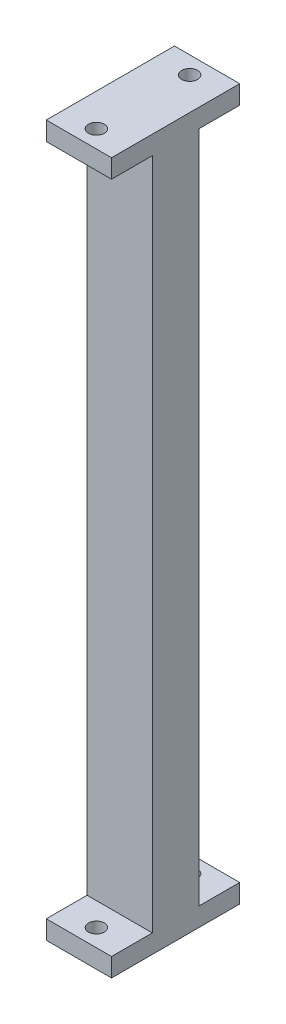
ISO-10303-21;
HEADER;
FILE_DESCRIPTION(('STEP AP214'),'2;1');
FILE_NAME('part.step','',(''),(''),'','','');
FILE_SCHEMA(('AUTOMOTIVE_DESIGN { 1 0 10303 214 1 1 1 1 }'));
ENDSEC;
DATA;
#1=APPLICATION_CONTEXT('core data for automotive mechanical design processes');
#2=APPLICATION_PROTOCOL_DEFINITION('international standard','automotive_design',2000,#1);
#3=PRODUCT_CONTEXT('',#1,'mechanical');
#4=PRODUCT('Part','Part','',(#3));
#5=PRODUCT_RELATED_PRODUCT_CATEGORY('part','',(#4));
#6=PRODUCT_DEFINITION_FORMATION('','',#4);
#7=PRODUCT_DEFINITION_CONTEXT('part definition',#1,'design');
#8=PRODUCT_DEFINITION('design','',#6,#7);
#9=PRODUCT_DEFINITION_SHAPE('','',#8);
#10=(LENGTH_UNIT() NAMED_UNIT(*) SI_UNIT(.MILLI.,.METRE.));
#11=(NAMED_UNIT(*) PLANE_ANGLE_UNIT() SI_UNIT($,.RADIAN.));
#12=(NAMED_UNIT(*) SI_UNIT($,.STERADIAN.) SOLID_ANGLE_UNIT());
#13=UNCERTAINTY_MEASURE_WITH_UNIT(LENGTH_MEASURE(1.E-05),#10,'distance_accuracy_value','');
#14=(GEOMETRIC_REPRESENTATION_CONTEXT(3) GLOBAL_UNCERTAINTY_ASSIGNED_CONTEXT((#13)) GLOBAL_UNIT_ASSIGNED_CONTEXT((#10,
#11,#12)) REPRESENTATION_CONTEXT('',''));
#15=CARTESIAN_POINT('',(0.,0.,0.));
#16=DIRECTION('',(0.,0.,1.));
#17=DIRECTION('',(1.,0.,0.));
#18=AXIS2_PLACEMENT_3D('',#15,#16,#17);
#19=CARTESIAN_POINT('',(7.,76.2,-5.));
#20=DIRECTION('',(-1.,0.,0.));
#21=DIRECTION('',(0.,0.,1.));
#22=AXIS2_PLACEMENT_3D('',#19,#20,#21);
#23=PLANE('',#22);
#24=DIRECTION('',(0.,-1.,0.));
#25=VECTOR('',#24,1.);
#26=CARTESIAN_POINT('',(7.,76.2,5.));
#27=LINE('',#26,#25);
#28=CARTESIAN_POINT('',(7.,72.2,5.));
#29=VERTEX_POINT('',#28);
#30=CARTESIAN_POINT('',(7.,-72.1999999999999,5.));
#31=VERTEX_POINT('',#30);
#32=EDGE_CURVE('E140',#29,#31,#27,.T.);
#33=ORIENTED_EDGE('',*,*,#32,.T.);
#34=DIRECTION('',(0.,0.,-1.));
#35=VECTOR('',#34,1.);
#36=CARTESIAN_POINT('',(6.99999999999999,-72.2,-13.75));
#37=LINE('',#36,#35);
#38=CARTESIAN_POINT('',(7.,-72.2,13.75));
#39=VERTEX_POINT('',#38);
#40=EDGE_CURVE('E122',#39,#31,#37,.T.);
#41=ORIENTED_EDGE('',*,*,#40,.F.);
#42=DIRECTION('',(0.,-1.,0.));
#43=VECTOR('',#42,1.);
#44=CARTESIAN_POINT('',(7.,-72.2,13.75));
#45=LINE('',#44,#43);
#46=CARTESIAN_POINT('',(7.,-76.2,13.75));
#47=VERTEX_POINT('',#46);
#48=EDGE_CURVE('E131',#39,#47,#45,.T.);
#49=ORIENTED_EDGE('',*,*,#48,.T.);
#50=DIRECTION('',(0.,0.,-1.));
#51=VECTOR('',#50,1.);
#52=CARTESIAN_POINT('',(7.,-76.2,-5.));
#53=LINE('',#52,#51);
#54=CARTESIAN_POINT('',(6.99999999999999,-76.2,-13.75));
#55=VERTEX_POINT('',#54);
#56=EDGE_CURVE('E211',#47,#55,#53,.T.);
#57=ORIENTED_EDGE('',*,*,#56,.T.);
#58=DIRECTION('',(0.,-1.,0.));
#59=VECTOR('',#58,1.);
#60=CARTESIAN_POINT('',(6.99999999999999,-72.2,-13.75));
#61=LINE('',#60,#59);
#62=CARTESIAN_POINT('',(6.99999999999999,-72.2,-13.75));
#63=VERTEX_POINT('',#62);
#64=EDGE_CURVE('E155',#63,#55,#61,.T.);
#65=ORIENTED_EDGE('',*,*,#64,.F.);
#66=CARTESIAN_POINT('',(6.99999999999999,-72.2,-5.));
#67=VERTEX_POINT('',#66);
#68=EDGE_CURVE('E141',#67,#63,#37,.T.);
#69=ORIENTED_EDGE('',*,*,#68,.F.);
#70=DIRECTION('',(0.,-1.,0.));
#71=VECTOR('',#70,1.);
#72=CARTESIAN_POINT('',(7.,76.2,-5.));
#73=LINE('',#72,#71);
#74=CARTESIAN_POINT('',(6.99999999999999,72.2,-5.));
#75=VERTEX_POINT('',#74);
#76=EDGE_CURVE('E224',#75,#67,#73,.T.);
#77=ORIENTED_EDGE('',*,*,#76,.F.);
#78=DIRECTION('',(0.,0.,-1.));
#79=VECTOR('',#78,1.);
#80=CARTESIAN_POINT('',(6.99999999999999,72.2,-13.75));
#81=LINE('',#80,#79);
#82=CARTESIAN_POINT('',(6.99999999999999,72.2,-13.75));
#83=VERTEX_POINT('',#82);
#84=EDGE_CURVE('E181',#75,#83,#81,.T.);
#85=ORIENTED_EDGE('',*,*,#84,.T.);
#86=DIRECTION('',(0.,1.,0.));
#87=VECTOR('',#86,1.);
#88=CARTESIAN_POINT('',(6.99999999999999,72.2,-13.75));
#89=LINE('',#88,#87);
#90=CARTESIAN_POINT('',(6.99999999999999,76.2,-13.75));
#91=VERTEX_POINT('',#90);
#92=EDGE_CURVE('E191',#83,#91,#89,.T.);
#93=ORIENTED_EDGE('',*,*,#92,.T.);
#94=DIRECTION('',(0.,0.,-1.));
#95=VECTOR('',#94,1.);
#96=CARTESIAN_POINT('',(7.,76.2,-5.));
#97=LINE('',#96,#95);
#98=CARTESIAN_POINT('',(7.,76.2,13.75));
#99=VERTEX_POINT('',#98);
#100=EDGE_CURVE('E212',#99,#91,#97,.T.);
#101=ORIENTED_EDGE('',*,*,#100,.F.);
#102=DIRECTION('',(0.,1.,0.));
#103=VECTOR('',#102,1.);
#104=CARTESIAN_POINT('',(7.,72.2,13.75));
#105=LINE('',#104,#103);
#106=CARTESIAN_POINT('',(7.,72.2,13.75));
#107=VERTEX_POINT('',#106);
#108=EDGE_CURVE('E197',#107,#99,#105,.T.);
#109=ORIENTED_EDGE('',*,*,#108,.F.);
#110=EDGE_CURVE('E178',#107,#29,#81,.T.);
#111=ORIENTED_EDGE('',*,*,#110,.T.);
#112=EDGE_LOOP('',(#33,#41,#49,#57,#65,#69,#77,#85,#93,#101,#109,#111));
#113=FACE_BOUND('',#112,.T.);
#114=ADVANCED_FACE('F32',(#113),#23,.F.);
#115=CARTESIAN_POINT('',(-7.,76.2,-5.));
#116=DIRECTION('',(0.,0.,1.));
#117=DIRECTION('',(1.,0.,0.));
#118=AXIS2_PLACEMENT_3D('',#115,#116,#117);
#119=PLANE('',#118);
#120=ORIENTED_EDGE('',*,*,#76,.T.);
#121=DIRECTION('',(-1.,0.,0.));
#122=VECTOR('',#121,1.);
#123=CARTESIAN_POINT('',(-7.,-72.2,-5.));
#124=LINE('',#123,#122);
#125=CARTESIAN_POINT('',(-7.,-72.2,-5.));
#126=VERTEX_POINT('',#125);
#127=EDGE_CURVE('E158',#67,#126,#124,.T.);
#128=ORIENTED_EDGE('',*,*,#127,.T.);
#129=DIRECTION('',(0.,-1.,0.));
#130=VECTOR('',#129,1.);
#131=CARTESIAN_POINT('',(-7.,76.2,-5.));
#132=LINE('',#131,#130);
#133=CARTESIAN_POINT('',(-7.,72.2,-5.));
#134=VERTEX_POINT('',#133);
#135=EDGE_CURVE('E221',#134,#126,#132,.T.);
#136=ORIENTED_EDGE('',*,*,#135,.F.);
#137=DIRECTION('',(1.,0.,0.));
#138=VECTOR('',#137,1.);
#139=CARTESIAN_POINT('',(-7.,72.2,-5.));
#140=LINE('',#139,#138);
#141=EDGE_CURVE('E200',#134,#75,#140,.T.);
#142=ORIENTED_EDGE('',*,*,#141,.T.);
#143=EDGE_LOOP('',(#120,#128,#136,#142));
#144=FACE_BOUND('',#143,.T.);
#145=ADVANCED_FACE('F248',(#144),#119,.F.);
#146=CARTESIAN_POINT('',(-7.,76.2,-5.));
#147=DIRECTION('',(1.,0.,0.));
#148=DIRECTION('',(0.,0.,-1.));
#149=AXIS2_PLACEMENT_3D('',#146,#147,#148);
#150=PLANE('',#149);
#151=ORIENTED_EDGE('',*,*,#135,.T.);
#152=DIRECTION('',(0.,0.,1.));
#153=VECTOR('',#152,1.);
#154=CARTESIAN_POINT('',(-7.,-72.2,-13.75));
#155=LINE('',#154,#153);
#156=CARTESIAN_POINT('',(-7.,-72.2,-13.75));
#157=VERTEX_POINT('',#156);
#158=EDGE_CURVE('E148',#157,#126,#155,.T.);
#159=ORIENTED_EDGE('',*,*,#158,.F.);
#160=DIRECTION('',(0.,-1.,0.));
#161=VECTOR('',#160,1.);
#162=CARTESIAN_POINT('',(-7.,-72.2,-13.75));
#163=LINE('',#162,#161);
#164=CARTESIAN_POINT('',(-7.,-76.2,-13.75));
#165=VERTEX_POINT('',#164);
#166=EDGE_CURVE('E159',#157,#165,#163,.T.);
#167=ORIENTED_EDGE('',*,*,#166,.T.);
#168=DIRECTION('',(0.,0.,1.));
#169=VECTOR('',#168,1.);
#170=CARTESIAN_POINT('',(-7.,-76.2,-5.));
#171=LINE('',#170,#169);
#172=CARTESIAN_POINT('',(-7.,-76.2,13.75));
#173=VERTEX_POINT('',#172);
#174=EDGE_CURVE('E215',#165,#173,#171,.T.);
#175=ORIENTED_EDGE('',*,*,#174,.T.);
#176=DIRECTION('',(0.,-1.,0.));
#177=VECTOR('',#176,1.);
#178=CARTESIAN_POINT('',(-7.,-72.2,13.75));
#179=LINE('',#178,#177);
#180=CARTESIAN_POINT('',(-7.,-72.2,13.75));
#181=VERTEX_POINT('',#180);
#182=EDGE_CURVE('E136',#181,#173,#179,.T.);
#183=ORIENTED_EDGE('',*,*,#182,.F.);
#184=CARTESIAN_POINT('',(-7.,-72.1999999999999,5.));
#185=VERTEX_POINT('',#184);
#186=EDGE_CURVE('E124',#185,#181,#155,.T.);
#187=ORIENTED_EDGE('',*,*,#186,.F.);
#188=DIRECTION('',(0.,-1.,0.));
#189=VECTOR('',#188,1.);
#190=CARTESIAN_POINT('',(-7.,76.2,5.));
#191=LINE('',#190,#189);
#192=CARTESIAN_POINT('',(-7.,72.2,5.));
#193=VERTEX_POINT('',#192);
#194=EDGE_CURVE('E45',#193,#185,#191,.T.);
#195=ORIENTED_EDGE('',*,*,#194,.F.);
#196=DIRECTION('',(0.,0.,1.));
#197=VECTOR('',#196,1.);
#198=CARTESIAN_POINT('',(-7.,72.2,-13.75));
#199=LINE('',#198,#197);
#200=CARTESIAN_POINT('',(-7.,72.2,13.75));
#201=VERTEX_POINT('',#200);
#202=EDGE_CURVE('E184',#193,#201,#199,.T.);
#203=ORIENTED_EDGE('',*,*,#202,.T.);
#204=DIRECTION('',(0.,1.,0.));
#205=VECTOR('',#204,1.);
#206=CARTESIAN_POINT('',(-7.,72.2,13.75));
#207=LINE('',#206,#205);
#208=CARTESIAN_POINT('',(-7.,76.2,13.75));
#209=VERTEX_POINT('',#208);
#210=EDGE_CURVE('E201',#201,#209,#207,.T.);
#211=ORIENTED_EDGE('',*,*,#210,.T.);
#212=DIRECTION('',(0.,0.,1.));
#213=VECTOR('',#212,1.);
#214=CARTESIAN_POINT('',(-7.,76.2,-5.));
#215=LINE('',#214,#213);
#216=CARTESIAN_POINT('',(-7.,76.2,-13.75));
#217=VERTEX_POINT('',#216);
#218=EDGE_CURVE('E214',#217,#209,#215,.T.);
#219=ORIENTED_EDGE('',*,*,#218,.F.);
#220=DIRECTION('',(0.,1.,0.));
#221=VECTOR('',#220,1.);
#222=CARTESIAN_POINT('',(-7.,72.2,-13.75));
#223=LINE('',#222,#221);
#224=CARTESIAN_POINT('',(-7.,72.2,-13.75));
#225=VERTEX_POINT('',#224);
#226=EDGE_CURVE('E204',#225,#217,#223,.T.);
#227=ORIENTED_EDGE('',*,*,#226,.F.);
#228=EDGE_CURVE('E185',#225,#134,#199,.T.);
#229=ORIENTED_EDGE('',*,*,#228,.T.);
#230=EDGE_LOOP('',(#151,#159,#167,#175,#183,#187,#195,#203,#211,#219,#227,#229));
#231=FACE_BOUND('',#230,.T.);
#232=ADVANCED_FACE('F230',(#231),#150,.F.);
#233=CARTESIAN_POINT('',(-7.,76.2,5.));
#234=DIRECTION('',(0.,0.,-1.));
#235=DIRECTION('',(-1.,0.,0.));
#236=AXIS2_PLACEMENT_3D('',#233,#234,#235);
#237=PLANE('',#236);
#238=ORIENTED_EDGE('',*,*,#194,.T.);
#239=DIRECTION('',(1.,0.,0.));
#240=VECTOR('',#239,1.);
#241=CARTESIAN_POINT('',(-7.,-72.2,5.));
#242=LINE('',#241,#240);
#243=EDGE_CURVE('E11',#185,#31,#242,.T.);
#244=ORIENTED_EDGE('',*,*,#243,.T.);
#245=ORIENTED_EDGE('',*,*,#32,.F.);
#246=DIRECTION('',(-1.,0.,0.));
#247=VECTOR('',#246,1.);
#248=CARTESIAN_POINT('',(-7.,72.2,5.));
#249=LINE('',#248,#247);
#250=EDGE_CURVE('E39',#29,#193,#249,.T.);
#251=ORIENTED_EDGE('',*,*,#250,.T.);
#252=EDGE_LOOP('',(#238,#244,#245,#251));
#253=FACE_BOUND('',#252,.T.);
#254=ADVANCED_FACE('F226',(#253),#237,.F.);
#255=CARTESIAN_POINT('',(0.,76.2,0.));
#256=DIRECTION('',(0.,1.,0.));
#257=DIRECTION('',(0.,0.,1.));
#258=AXIS2_PLACEMENT_3D('',#255,#256,#257);
#259=PLANE('',#258);
#260=ORIENTED_EDGE('',*,*,#100,.T.);
#261=DIRECTION('',(-1.,0.,0.));
#262=VECTOR('',#261,1.);
#263=CARTESIAN_POINT('',(6.99999999999999,76.2,-13.75));
#264=LINE('',#263,#262);
#265=EDGE_CURVE('E175',#91,#217,#264,.T.);
#266=ORIENTED_EDGE('',*,*,#265,.T.);
#267=ORIENTED_EDGE('',*,*,#218,.T.);
#268=DIRECTION('',(1.,0.,0.));
#269=VECTOR('',#268,1.);
#270=CARTESIAN_POINT('',(7.,76.2,13.75));
#271=LINE('',#270,#269);
#272=EDGE_CURVE('E194',#209,#99,#271,.T.);
#273=ORIENTED_EDGE('',*,*,#272,.T.);
#274=EDGE_LOOP('',(#260,#266,#267,#273));
#275=FACE_BOUND('',#274,.T.);
#276=CARTESIAN_POINT('',(0.,76.2,10.));
#277=DIRECTION('',(0.,1.,0.));
#278=DIRECTION('',(0.,0.,1.));
#279=AXIS2_PLACEMENT_3D('',#276,#277,#278);
#280=CIRCLE('',#279,1.7);
#281=CARTESIAN_POINT('',(0.,76.2,11.7));
#282=VERTEX_POINT('',#281);
#283=EDGE_CURVE('E165',#282,#282,#280,.T.);
#284=ORIENTED_EDGE('',*,*,#283,.F.);
#285=EDGE_LOOP('',(#284));
#286=FACE_BOUND('',#285,.T.);
#287=CARTESIAN_POINT('',(0.,76.2,-10.));
#288=DIRECTION('',(0.,1.,0.));
#289=DIRECTION('',(0.,0.,1.));
#290=AXIS2_PLACEMENT_3D('',#287,#288,#289);
#291=CIRCLE('',#290,1.7);
#292=CARTESIAN_POINT('',(0.,76.2,-8.3));
#293=VERTEX_POINT('',#292);
#294=EDGE_CURVE('E169',#293,#293,#291,.T.);
#295=ORIENTED_EDGE('',*,*,#294,.F.);
#296=EDGE_LOOP('',(#295));
#297=FACE_BOUND('',#296,.T.);
#298=ADVANCED_FACE('F262',(#275,#286,#297),#259,.T.);
#299=CARTESIAN_POINT('',(0.,-76.2,0.));
#300=DIRECTION('',(0.,1.,0.));
#301=DIRECTION('',(0.,0.,1.));
#302=AXIS2_PLACEMENT_3D('',#299,#300,#301);
#303=PLANE('',#302);
#304=ORIENTED_EDGE('',*,*,#56,.F.);
#305=DIRECTION('',(1.,0.,0.));
#306=VECTOR('',#305,1.);
#307=CARTESIAN_POINT('',(7.,-76.2,13.75));
#308=LINE('',#307,#306);
#309=EDGE_CURVE('E134',#173,#47,#308,.T.);
#310=ORIENTED_EDGE('',*,*,#309,.F.);
#311=ORIENTED_EDGE('',*,*,#174,.F.);
#312=DIRECTION('',(-1.,0.,0.));
#313=VECTOR('',#312,1.);
#314=CARTESIAN_POINT('',(6.99999999999999,-76.2,-13.75));
#315=LINE('',#314,#313);
#316=EDGE_CURVE('E143',#55,#165,#315,.T.);
#317=ORIENTED_EDGE('',*,*,#316,.F.);
#318=EDGE_LOOP('',(#304,#310,#311,#317));
#319=FACE_BOUND('',#318,.T.);
#320=CARTESIAN_POINT('',(0.,-76.2,10.));
#321=DIRECTION('',(0.,1.,0.));
#322=DIRECTION('',(0.,0.,1.));
#323=AXIS2_PLACEMENT_3D('',#320,#321,#322);
#324=CIRCLE('',#323,1.7);
#325=CARTESIAN_POINT('',(0.,-76.2,11.7));
#326=VERTEX_POINT('',#325);
#327=EDGE_CURVE('E424',#326,#326,#324,.T.);
#328=ORIENTED_EDGE('',*,*,#327,.T.);
#329=EDGE_LOOP('',(#328));
#330=FACE_BOUND('',#329,.T.);
#331=CARTESIAN_POINT('',(0.,-76.2,-10.));
#332=DIRECTION('',(0.,1.,0.));
#333=DIRECTION('',(0.,0.,1.));
#334=AXIS2_PLACEMENT_3D('',#331,#332,#333);
#335=CIRCLE('',#334,1.7);
#336=CARTESIAN_POINT('',(0.,-76.2,-8.3));
#337=VERTEX_POINT('',#336);
#338=EDGE_CURVE('E145',#337,#337,#335,.T.);
#339=ORIENTED_EDGE('',*,*,#338,.T.);
#340=EDGE_LOOP('',(#339));
#341=FACE_BOUND('',#340,.T.);
#342=ADVANCED_FACE('F233',(#319,#330,#341),#303,.F.);
#343=CARTESIAN_POINT('',(7.,72.2,13.75));
#344=DIRECTION('',(0.,0.,1.));
#345=DIRECTION('',(1.,0.,0.));
#346=AXIS2_PLACEMENT_3D('',#343,#344,#345);
#347=PLANE('',#346);
#348=ORIENTED_EDGE('',*,*,#272,.F.);
#349=ORIENTED_EDGE('',*,*,#210,.F.);
#350=DIRECTION('',(1.,0.,0.));
#351=VECTOR('',#350,1.);
#352=CARTESIAN_POINT('',(7.,72.2,13.75));
#353=LINE('',#352,#351);
#354=EDGE_CURVE('E188',#201,#107,#353,.T.);
#355=ORIENTED_EDGE('',*,*,#354,.T.);
#356=ORIENTED_EDGE('',*,*,#108,.T.);
#357=EDGE_LOOP('',(#348,#349,#355,#356));
#358=FACE_BOUND('',#357,.T.);
#359=ADVANCED_FACE('F260',(#358),#347,.T.);
#360=CARTESIAN_POINT('',(0.,72.2,10.));
#361=DIRECTION('',(0.,1.,0.));
#362=DIRECTION('',(0.,0.,1.));
#363=AXIS2_PLACEMENT_3D('',#360,#361,#362);
#364=CYLINDRICAL_SURFACE('',#363,1.7);
#365=CARTESIAN_POINT('',(0.,72.2,10.));
#366=DIRECTION('',(0.,1.,0.));
#367=DIRECTION('',(0.,0.,1.));
#368=AXIS2_PLACEMENT_3D('',#365,#366,#367);
#369=CIRCLE('',#368,1.7);
#370=CARTESIAN_POINT('',(0.,72.2,11.7));
#371=VERTEX_POINT('',#370);
#372=EDGE_CURVE('E166',#371,#371,#369,.T.);
#373=ORIENTED_EDGE('',*,*,#372,.F.);
#374=EDGE_LOOP('',(#373));
#375=FACE_BOUND('',#374,.T.);
#376=ORIENTED_EDGE('',*,*,#283,.T.);
#377=EDGE_LOOP('',(#376));
#378=FACE_BOUND('',#377,.T.);
#379=ADVANCED_FACE('F266',(#375,#378),#364,.F.);
#380=CARTESIAN_POINT('',(0.,72.2,0.));
#381=DIRECTION('',(0.,-1.,0.));
#382=DIRECTION('',(0.,0.,-1.));
#383=AXIS2_PLACEMENT_3D('',#380,#381,#382);
#384=PLANE('',#383);
#385=ORIENTED_EDGE('',*,*,#372,.T.);
#386=EDGE_LOOP('',(#385));
#387=FACE_BOUND('',#386,.T.);
#388=ORIENTED_EDGE('',*,*,#250,.F.);
#389=ORIENTED_EDGE('',*,*,#110,.F.);
#390=ORIENTED_EDGE('',*,*,#354,.F.);
#391=ORIENTED_EDGE('',*,*,#202,.F.);
#392=EDGE_LOOP('',(#388,#389,#390,#391));
#393=FACE_BOUND('',#392,.T.);
#394=ADVANCED_FACE('F264',(#387,#393),#384,.T.);
#395=CARTESIAN_POINT('',(0.,72.2,-10.));
#396=DIRECTION('',(0.,1.,0.));
#397=DIRECTION('',(0.,0.,1.));
#398=AXIS2_PLACEMENT_3D('',#395,#396,#397);
#399=CIRCLE('',#398,1.7);
#400=CARTESIAN_POINT('',(0.,72.2,-8.3));
#401=VERTEX_POINT('',#400);
#402=EDGE_CURVE('E172',#401,#401,#399,.T.);
#403=ORIENTED_EDGE('',*,*,#402,.T.);
#404=EDGE_LOOP('',(#403));
#405=FACE_BOUND('',#404,.T.);
#406=ORIENTED_EDGE('',*,*,#141,.F.);
#407=ORIENTED_EDGE('',*,*,#228,.F.);
#408=DIRECTION('',(-1.,0.,0.));
#409=VECTOR('',#408,1.);
#410=CARTESIAN_POINT('',(6.99999999999999,72.2,-13.75));
#411=LINE('',#410,#409);
#412=EDGE_CURVE('E180',#83,#225,#411,.T.);
#413=ORIENTED_EDGE('',*,*,#412,.F.);
#414=ORIENTED_EDGE('',*,*,#84,.F.);
#415=EDGE_LOOP('',(#406,#407,#413,#414));
#416=FACE_BOUND('',#415,.T.);
#417=ADVANCED_FACE('F252',(#405,#416),#384,.T.);
#418=CARTESIAN_POINT('',(6.99999999999999,72.2,-13.75));
#419=DIRECTION('',(0.,0.,-1.));
#420=DIRECTION('',(-1.,0.,0.));
#421=AXIS2_PLACEMENT_3D('',#418,#419,#420);
#422=PLANE('',#421);
#423=ORIENTED_EDGE('',*,*,#265,.F.);
#424=ORIENTED_EDGE('',*,*,#92,.F.);
#425=ORIENTED_EDGE('',*,*,#412,.T.);
#426=ORIENTED_EDGE('',*,*,#226,.T.);
#427=EDGE_LOOP('',(#423,#424,#425,#426));
#428=FACE_BOUND('',#427,.T.);
#429=ADVANCED_FACE('F256',(#428),#422,.T.);
#430=CARTESIAN_POINT('',(0.,72.2,-10.));
#431=DIRECTION('',(0.,1.,0.));
#432=DIRECTION('',(0.,0.,1.));
#433=AXIS2_PLACEMENT_3D('',#430,#431,#432);
#434=CYLINDRICAL_SURFACE('',#433,1.7);
#435=ORIENTED_EDGE('',*,*,#402,.F.);
#436=EDGE_LOOP('',(#435));
#437=FACE_BOUND('',#436,.T.);
#438=ORIENTED_EDGE('',*,*,#294,.T.);
#439=EDGE_LOOP('',(#438));
#440=FACE_BOUND('',#439,.T.);
#441=ADVANCED_FACE('F294',(#437,#440),#434,.F.);
#442=CARTESIAN_POINT('',(0.,-72.2,10.));
#443=DIRECTION('',(0.,-1.,0.));
#444=DIRECTION('',(0.,0.,-1.));
#445=AXIS2_PLACEMENT_3D('',#442,#443,#444);
#446=CYLINDRICAL_SURFACE('',#445,1.7);
#447=CARTESIAN_POINT('',(0.,-72.2,10.));
#448=DIRECTION('',(0.,1.,0.));
#449=DIRECTION('',(0.,0.,1.));
#450=AXIS2_PLACEMENT_3D('',#447,#448,#449);
#451=CIRCLE('',#450,1.7);
#452=CARTESIAN_POINT('',(0.,-72.2,11.7));
#453=VERTEX_POINT('',#452);
#454=EDGE_CURVE('E422',#453,#453,#451,.T.);
#455=ORIENTED_EDGE('',*,*,#454,.T.);
#456=EDGE_LOOP('',(#455));
#457=FACE_BOUND('',#456,.T.);
#458=ORIENTED_EDGE('',*,*,#327,.F.);
#459=EDGE_LOOP('',(#458));
#460=FACE_BOUND('',#459,.T.);
#461=ADVANCED_FACE('F329',(#457,#460),#446,.F.);
#462=CARTESIAN_POINT('',(7.,-72.2,13.75));
#463=DIRECTION('',(0.,0.,-1.));
#464=DIRECTION('',(-1.,0.,0.));
#465=AXIS2_PLACEMENT_3D('',#462,#463,#464);
#466=PLANE('',#465);
#467=ORIENTED_EDGE('',*,*,#309,.T.);
#468=ORIENTED_EDGE('',*,*,#48,.F.);
#469=DIRECTION('',(1.,0.,0.));
#470=VECTOR('',#469,1.);
#471=CARTESIAN_POINT('',(7.,-72.2,13.75));
#472=LINE('',#471,#470);
#473=EDGE_CURVE('E118',#181,#39,#472,.T.);
#474=ORIENTED_EDGE('',*,*,#473,.F.);
#475=ORIENTED_EDGE('',*,*,#182,.T.);
#476=EDGE_LOOP('',(#467,#468,#474,#475));
#477=FACE_BOUND('',#476,.T.);
#478=ADVANCED_FACE('F132',(#477),#466,.F.);
#479=CARTESIAN_POINT('',(0.,-72.2,0.));
#480=DIRECTION('',(0.,1.,0.));
#481=DIRECTION('',(0.,0.,-1.));
#482=AXIS2_PLACEMENT_3D('',#479,#480,#481);
#483=PLANE('',#482);
#484=ORIENTED_EDGE('',*,*,#454,.F.);
#485=EDGE_LOOP('',(#484));
#486=FACE_BOUND('',#485,.T.);
#487=ORIENTED_EDGE('',*,*,#243,.F.);
#488=ORIENTED_EDGE('',*,*,#186,.T.);
#489=ORIENTED_EDGE('',*,*,#473,.T.);
#490=ORIENTED_EDGE('',*,*,#40,.T.);
#491=EDGE_LOOP('',(#487,#488,#489,#490));
#492=FACE_BOUND('',#491,.T.);
#493=ADVANCED_FACE('F120',(#486,#492),#483,.T.);
#494=CARTESIAN_POINT('',(0.,-72.2,-10.));
#495=DIRECTION('',(0.,1.,0.));
#496=DIRECTION('',(0.,0.,1.));
#497=AXIS2_PLACEMENT_3D('',#494,#495,#496);
#498=CIRCLE('',#497,1.7);
#499=CARTESIAN_POINT('',(0.,-72.2,-8.3));
#500=VERTEX_POINT('',#499);
#501=EDGE_CURVE('E152',#500,#500,#498,.T.);
#502=ORIENTED_EDGE('',*,*,#501,.F.);
#503=EDGE_LOOP('',(#502));
#504=FACE_BOUND('',#503,.T.);
#505=ORIENTED_EDGE('',*,*,#127,.F.);
#506=ORIENTED_EDGE('',*,*,#68,.T.);
#507=DIRECTION('',(-1.,0.,0.));
#508=VECTOR('',#507,1.);
#509=CARTESIAN_POINT('',(6.99999999999999,-72.2,-13.75));
#510=LINE('',#509,#508);
#511=EDGE_CURVE('E137',#63,#157,#510,.T.);
#512=ORIENTED_EDGE('',*,*,#511,.T.);
#513=ORIENTED_EDGE('',*,*,#158,.T.);
#514=EDGE_LOOP('',(#505,#506,#512,#513));
#515=FACE_BOUND('',#514,.T.);
#516=ADVANCED_FACE('F245',(#504,#515),#483,.T.);
#517=CARTESIAN_POINT('',(6.99999999999999,-72.2,-13.75));
#518=DIRECTION('',(0.,0.,1.));
#519=DIRECTION('',(1.,0.,0.));
#520=AXIS2_PLACEMENT_3D('',#517,#518,#519);
#521=PLANE('',#520);
#522=ORIENTED_EDGE('',*,*,#316,.T.);
#523=ORIENTED_EDGE('',*,*,#166,.F.);
#524=ORIENTED_EDGE('',*,*,#511,.F.);
#525=ORIENTED_EDGE('',*,*,#64,.T.);
#526=EDGE_LOOP('',(#522,#523,#524,#525));
#527=FACE_BOUND('',#526,.T.);
#528=ADVANCED_FACE('F241',(#527),#521,.F.);
#529=CARTESIAN_POINT('',(0.,-72.2,-10.));
#530=DIRECTION('',(0.,-1.,0.));
#531=DIRECTION('',(0.,0.,-1.));
#532=AXIS2_PLACEMENT_3D('',#529,#530,#531);
#533=CYLINDRICAL_SURFACE('',#532,1.7);
#534=ORIENTED_EDGE('',*,*,#501,.T.);
#535=EDGE_LOOP('',(#534));
#536=FACE_BOUND('',#535,.T.);
#537=ORIENTED_EDGE('',*,*,#338,.F.);
#538=EDGE_LOOP('',(#537));
#539=FACE_BOUND('',#538,.T.);
#540=ADVANCED_FACE('F403',(#536,#539),#533,.F.);
#541=CLOSED_SHELL('',(#114,#145,#232,#254,#298,#342,#359,#379,#394,#417,#429,#441,#461,#478,
#493,#516,#528,#540));
#542=MANIFOLD_SOLID_BREP('B2',#541);
#543=ADVANCED_BREP_SHAPE_REPRESENTATION('',(#18,#542),#14);
#544=SHAPE_DEFINITION_REPRESENTATION(#9,#543);
ENDSEC;
END-ISO-10303-21;
